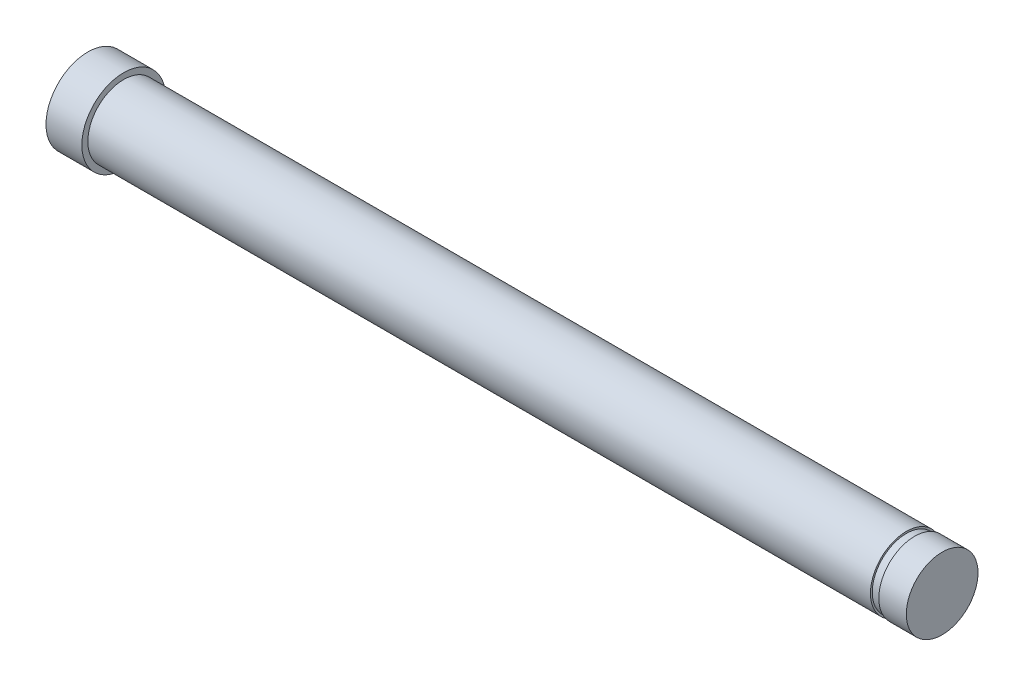
ISO-10303-21;
HEADER;
FILE_DESCRIPTION(('STEP AP214'),'2;1');
FILE_NAME('part.step','',(''),(''),'','','');
FILE_SCHEMA(('AUTOMOTIVE_DESIGN { 1 0 10303 214 1 1 1 1 }'));
ENDSEC;
DATA;
#1=APPLICATION_CONTEXT('core data for automotive mechanical design processes');
#2=APPLICATION_PROTOCOL_DEFINITION('international standard','automotive_design',2000,#1);
#3=PRODUCT_CONTEXT('',#1,'mechanical');
#4=PRODUCT('Part','Part','',(#3));
#5=PRODUCT_RELATED_PRODUCT_CATEGORY('part','',(#4));
#6=PRODUCT_DEFINITION_FORMATION('','',#4);
#7=PRODUCT_DEFINITION_CONTEXT('part definition',#1,'design');
#8=PRODUCT_DEFINITION('design','',#6,#7);
#9=PRODUCT_DEFINITION_SHAPE('','',#8);
#10=(LENGTH_UNIT() NAMED_UNIT(*) SI_UNIT(.MILLI.,.METRE.));
#11=(NAMED_UNIT(*) PLANE_ANGLE_UNIT() SI_UNIT($,.RADIAN.));
#12=(NAMED_UNIT(*) SI_UNIT($,.STERADIAN.) SOLID_ANGLE_UNIT());
#13=UNCERTAINTY_MEASURE_WITH_UNIT(LENGTH_MEASURE(1.E-05),#10,'distance_accuracy_value','');
#14=(GEOMETRIC_REPRESENTATION_CONTEXT(3) GLOBAL_UNCERTAINTY_ASSIGNED_CONTEXT((#13)) GLOBAL_UNIT_ASSIGNED_CONTEXT((#10,
#11,#12)) REPRESENTATION_CONTEXT('',''));
#15=CARTESIAN_POINT('',(0.,0.,0.));
#16=DIRECTION('',(0.,0.,1.));
#17=DIRECTION('',(1.,0.,0.));
#18=AXIS2_PLACEMENT_3D('',#15,#16,#17);
#19=CARTESIAN_POINT('',(57.5,0.,0.));
#20=DIRECTION('',(-1.,0.,0.));
#21=DIRECTION('',(0.,0.,1.));
#22=AXIS2_PLACEMENT_3D('',#19,#20,#21);
#23=CYLINDRICAL_SURFACE('',#22,3.);
#24=CARTESIAN_POINT('',(-11.,0.,0.));
#25=DIRECTION('',(-1.,0.,0.));
#26=DIRECTION('',(0.,0.,1.));
#27=AXIS2_PLACEMENT_3D('',#24,#25,#26);
#28=CIRCLE('',#27,3.);
#29=CARTESIAN_POINT('',(-11.,0.,3.));
#30=VERTEX_POINT('',#29);
#31=EDGE_CURVE('E73',#30,#30,#28,.F.);
#32=ORIENTED_EDGE('',*,*,#31,.T.);
#33=EDGE_LOOP('',(#32));
#34=FACE_BOUND('',#33,.T.);
#35=CARTESIAN_POINT('',(54.5,0.,0.));
#36=DIRECTION('',(1.,0.,0.));
#37=DIRECTION('',(0.,0.,-1.));
#38=AXIS2_PLACEMENT_3D('',#35,#36,#37);
#39=CIRCLE('',#38,3.);
#40=CARTESIAN_POINT('',(54.5,0.,-3.));
#41=VERTEX_POINT('',#40);
#42=EDGE_CURVE('E95',#41,#41,#39,.T.);
#43=ORIENTED_EDGE('',*,*,#42,.F.);
#44=EDGE_LOOP('',(#43));
#45=FACE_BOUND('',#44,.T.);
#46=ADVANCED_FACE('F69',(#34,#45),#23,.T.);
#47=CARTESIAN_POINT('',(-11.,0.,0.));
#48=DIRECTION('',(-1.,0.,0.));
#49=DIRECTION('',(0.,0.,1.));
#50=AXIS2_PLACEMENT_3D('',#47,#48,#49);
#51=CYLINDRICAL_SURFACE('',#50,3.5);
#52=CARTESIAN_POINT('',(-11.,0.,0.));
#53=DIRECTION('',(-1.,0.,0.));
#54=DIRECTION('',(0.,0.,1.));
#55=AXIS2_PLACEMENT_3D('',#52,#53,#54);
#56=CIRCLE('',#55,3.5);
#57=CARTESIAN_POINT('',(-11.,0.,3.5));
#58=VERTEX_POINT('',#57);
#59=EDGE_CURVE('E86',#58,#58,#56,.T.);
#60=ORIENTED_EDGE('',*,*,#59,.T.);
#61=EDGE_LOOP('',(#60));
#62=FACE_BOUND('',#61,.T.);
#63=CARTESIAN_POINT('',(-14.,0.,0.));
#64=DIRECTION('',(-1.,0.,0.));
#65=DIRECTION('',(0.,0.,1.));
#66=AXIS2_PLACEMENT_3D('',#63,#64,#65);
#67=CIRCLE('',#66,3.5);
#68=CARTESIAN_POINT('',(-14.,0.,3.5));
#69=VERTEX_POINT('',#68);
#70=EDGE_CURVE('E88',#69,#69,#67,.T.);
#71=ORIENTED_EDGE('',*,*,#70,.F.);
#72=EDGE_LOOP('',(#71));
#73=FACE_BOUND('',#72,.T.);
#74=ADVANCED_FACE('F132',(#62,#73),#51,.T.);
#75=CARTESIAN_POINT('',(-11.,0.,0.));
#76=DIRECTION('',(-1.,0.,0.));
#77=DIRECTION('',(0.,0.,1.));
#78=AXIS2_PLACEMENT_3D('',#75,#76,#77);
#79=PLANE('',#78);
#80=ORIENTED_EDGE('',*,*,#31,.F.);
#81=EDGE_LOOP('',(#80));
#82=FACE_BOUND('',#81,.T.);
#83=ORIENTED_EDGE('',*,*,#59,.F.);
#84=EDGE_LOOP('',(#83));
#85=FACE_BOUND('',#84,.T.);
#86=ADVANCED_FACE('F138',(#82,#85),#79,.F.);
#87=CARTESIAN_POINT('',(-14.,0.,0.));
#88=DIRECTION('',(-1.,0.,0.));
#89=DIRECTION('',(0.,0.,1.));
#90=AXIS2_PLACEMENT_3D('',#87,#88,#89);
#91=PLANE('',#90);
#92=ORIENTED_EDGE('',*,*,#70,.T.);
#93=EDGE_LOOP('',(#92));
#94=FACE_BOUND('',#93,.T.);
#95=ADVANCED_FACE('F127',(#94),#91,.T.);
#96=CARTESIAN_POINT('',(55.2,0.,0.));
#97=DIRECTION('',(1.,0.,0.));
#98=DIRECTION('',(0.,0.,-1.));
#99=AXIS2_PLACEMENT_3D('',#96,#97,#98);
#100=PLANE('',#99);
#101=CARTESIAN_POINT('',(55.2,0.,0.));
#102=DIRECTION('',(1.,0.,0.));
#103=DIRECTION('',(0.,0.,-1.));
#104=AXIS2_PLACEMENT_3D('',#101,#102,#103);
#105=CIRCLE('',#104,3.);
#106=CARTESIAN_POINT('',(55.2,0.,-3.));
#107=VERTEX_POINT('',#106);
#108=EDGE_CURVE('E91',#107,#107,#105,.T.);
#109=ORIENTED_EDGE('',*,*,#108,.F.);
#110=EDGE_LOOP('',(#109));
#111=FACE_BOUND('',#110,.T.);
#112=CARTESIAN_POINT('',(55.2,0.,0.));
#113=DIRECTION('',(1.,0.,0.));
#114=DIRECTION('',(0.,0.,-1.));
#115=AXIS2_PLACEMENT_3D('',#112,#113,#114);
#116=CIRCLE('',#115,2.85);
#117=CARTESIAN_POINT('',(55.2,0.,-2.85));
#118=VERTEX_POINT('',#117);
#119=EDGE_CURVE('E99',#118,#118,#116,.T.);
#120=ORIENTED_EDGE('',*,*,#119,.T.);
#121=EDGE_LOOP('',(#120));
#122=FACE_BOUND('',#121,.T.);
#123=ADVANCED_FACE('F112',(#111,#122),#100,.F.);
#124=CARTESIAN_POINT('',(54.5,0.,0.));
#125=DIRECTION('',(1.,0.,0.));
#126=DIRECTION('',(0.,0.,-1.));
#127=AXIS2_PLACEMENT_3D('',#124,#125,#126);
#128=PLANE('',#127);
#129=ORIENTED_EDGE('',*,*,#42,.T.);
#130=EDGE_LOOP('',(#129));
#131=FACE_BOUND('',#130,.T.);
#132=CARTESIAN_POINT('',(54.5,0.,0.));
#133=DIRECTION('',(1.,0.,0.));
#134=DIRECTION('',(0.,0.,-1.));
#135=AXIS2_PLACEMENT_3D('',#132,#133,#134);
#136=CIRCLE('',#135,2.85);
#137=CARTESIAN_POINT('',(54.5,0.,-2.85));
#138=VERTEX_POINT('',#137);
#139=EDGE_CURVE('E102',#138,#138,#136,.T.);
#140=ORIENTED_EDGE('',*,*,#139,.F.);
#141=EDGE_LOOP('',(#140));
#142=FACE_BOUND('',#141,.T.);
#143=ADVANCED_FACE('F118',(#131,#142),#128,.T.);
#144=CARTESIAN_POINT('',(55.2,0.,0.));
#145=DIRECTION('',(-1.,0.,0.));
#146=DIRECTION('',(0.,0.,1.));
#147=AXIS2_PLACEMENT_3D('',#144,#145,#146);
#148=CYLINDRICAL_SURFACE('',#147,2.85);
#149=ORIENTED_EDGE('',*,*,#119,.F.);
#150=EDGE_LOOP('',(#149));
#151=FACE_BOUND('',#150,.T.);
#152=ORIENTED_EDGE('',*,*,#139,.T.);
#153=EDGE_LOOP('',(#152));
#154=FACE_BOUND('',#153,.T.);
#155=ADVANCED_FACE('F114',(#151,#154),#148,.T.);
#156=CARTESIAN_POINT('',(57.5,0.,0.));
#157=DIRECTION('',(1.,0.,0.));
#158=DIRECTION('',(0.,0.,-1.));
#159=AXIS2_PLACEMENT_3D('',#156,#157,#158);
#160=PLANE('',#159);
#161=CARTESIAN_POINT('',(57.5,0.,0.));
#162=DIRECTION('',(1.,0.,0.));
#163=DIRECTION('',(0.,0.,-1.));
#164=AXIS2_PLACEMENT_3D('',#161,#162,#163);
#165=CIRCLE('',#164,3.);
#166=CARTESIAN_POINT('',(57.5,0.,-3.));
#167=VERTEX_POINT('',#166);
#168=EDGE_CURVE('E13',#167,#167,#165,.T.);
#169=ORIENTED_EDGE('',*,*,#168,.T.);
#170=EDGE_LOOP('',(#169));
#171=FACE_BOUND('',#170,.T.);
#172=ADVANCED_FACE('F117',(#171),#160,.T.);
#173=ORIENTED_EDGE('',*,*,#108,.T.);
#174=EDGE_LOOP('',(#173));
#175=FACE_BOUND('',#174,.T.);
#176=ORIENTED_EDGE('',*,*,#168,.F.);
#177=EDGE_LOOP('',(#176));
#178=FACE_BOUND('',#177,.T.);
#179=ADVANCED_FACE('F71',(#175,#178),#23,.T.);
#180=CLOSED_SHELL('',(#46,#74,#86,#95,#123,#143,#155,#172,#179));
#181=MANIFOLD_SOLID_BREP('B2',#180);
#182=ADVANCED_BREP_SHAPE_REPRESENTATION('',(#18,#181),#14);
#183=SHAPE_DEFINITION_REPRESENTATION(#9,#182);
ENDSEC;
END-ISO-10303-21;
